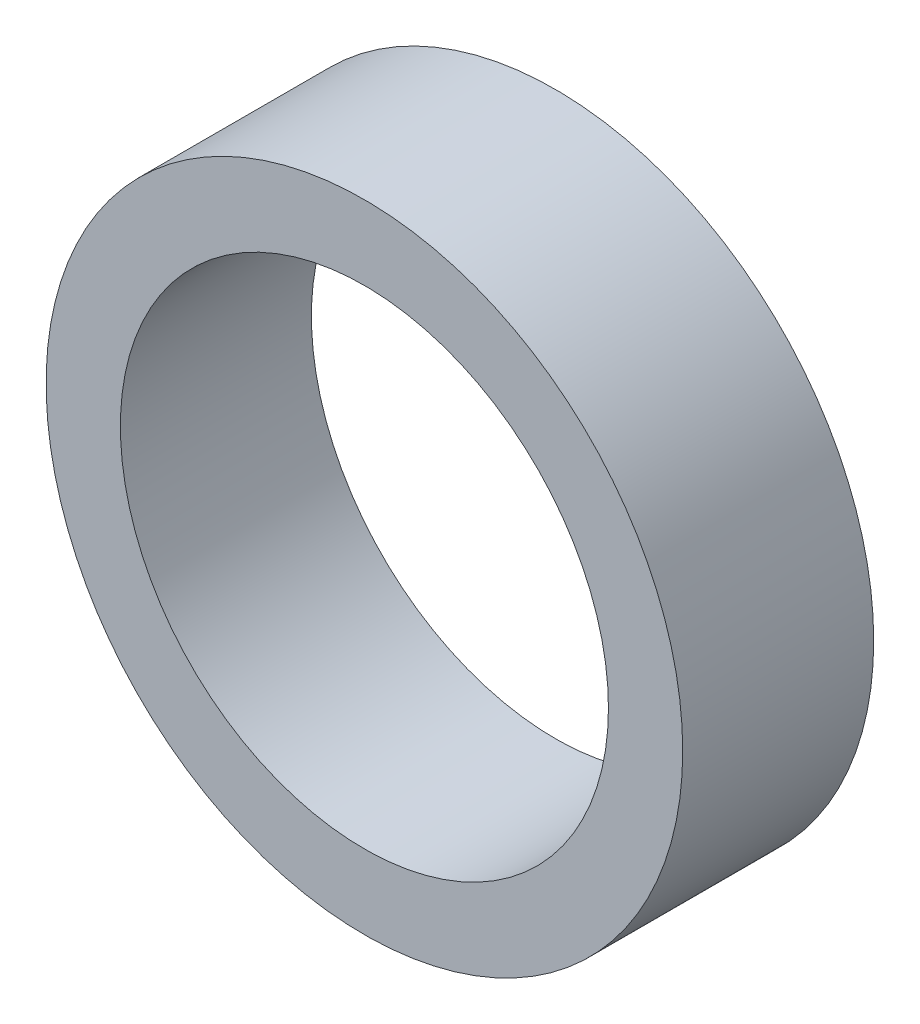
ISO-10303-21;
HEADER;
FILE_DESCRIPTION(('STEP AP214'),'2;1');
FILE_NAME('part.step','',(''),(''),'','','');
FILE_SCHEMA(('AUTOMOTIVE_DESIGN { 1 0 10303 214 1 1 1 1 }'));
ENDSEC;
DATA;
#1=APPLICATION_CONTEXT('core data for automotive mechanical design processes');
#2=APPLICATION_PROTOCOL_DEFINITION('international standard','automotive_design',2000,#1);
#3=PRODUCT_CONTEXT('',#1,'mechanical');
#4=PRODUCT('Part','Part','',(#3));
#5=PRODUCT_RELATED_PRODUCT_CATEGORY('part','',(#4));
#6=PRODUCT_DEFINITION_FORMATION('','',#4);
#7=PRODUCT_DEFINITION_CONTEXT('part definition',#1,'design');
#8=PRODUCT_DEFINITION('design','',#6,#7);
#9=PRODUCT_DEFINITION_SHAPE('','',#8);
#10=(LENGTH_UNIT() NAMED_UNIT(*) SI_UNIT(.MILLI.,.METRE.));
#11=(NAMED_UNIT(*) PLANE_ANGLE_UNIT() SI_UNIT($,.RADIAN.));
#12=(NAMED_UNIT(*) SI_UNIT($,.STERADIAN.) SOLID_ANGLE_UNIT());
#13=UNCERTAINTY_MEASURE_WITH_UNIT(LENGTH_MEASURE(1.E-05),#10,'distance_accuracy_value','');
#14=(GEOMETRIC_REPRESENTATION_CONTEXT(3) GLOBAL_UNCERTAINTY_ASSIGNED_CONTEXT((#13)) GLOBAL_UNIT_ASSIGNED_CONTEXT((#10,
#11,#12)) REPRESENTATION_CONTEXT('',''));
#15=CARTESIAN_POINT('',(0.,0.,0.));
#16=DIRECTION('',(0.,0.,1.));
#17=DIRECTION('',(1.,0.,0.));
#18=AXIS2_PLACEMENT_3D('',#15,#16,#17);
#19=CARTESIAN_POINT('',(0.,0.,18.));
#20=DIRECTION('',(0.,0.,1.));
#21=DIRECTION('',(1.,0.,0.));
#22=AXIS2_PLACEMENT_3D('',#19,#20,#21);
#23=PLANE('',#22);
#24=CARTESIAN_POINT('',(0.,0.,18.));
#25=DIRECTION('',(0.,0.,1.));
#26=DIRECTION('',(1.,0.,0.));
#27=AXIS2_PLACEMENT_3D('',#24,#25,#26);
#28=CIRCLE('',#27,30.);
#29=CARTESIAN_POINT('',(30.,0.,18.));
#30=VERTEX_POINT('',#29);
#31=EDGE_CURVE('E10',#30,#30,#28,.T.);
#32=ORIENTED_EDGE('',*,*,#31,.T.);
#33=EDGE_LOOP('',(#32));
#34=FACE_BOUND('',#33,.T.);
#35=CARTESIAN_POINT('',(0.,0.,18.));
#36=DIRECTION('',(0.,0.,1.));
#37=DIRECTION('',(1.,0.,0.));
#38=AXIS2_PLACEMENT_3D('',#35,#36,#37);
#39=CIRCLE('',#38,23.);
#40=CARTESIAN_POINT('',(23.,0.,18.));
#41=VERTEX_POINT('',#40);
#42=EDGE_CURVE('E48',#41,#41,#39,.T.);
#43=ORIENTED_EDGE('',*,*,#42,.F.);
#44=EDGE_LOOP('',(#43));
#45=FACE_BOUND('',#44,.T.);
#46=ADVANCED_FACE('F37',(#34,#45),#23,.T.);
#47=CARTESIAN_POINT('',(0.,0.,0.));
#48=DIRECTION('',(0.,0.,1.));
#49=DIRECTION('',(1.,0.,0.));
#50=AXIS2_PLACEMENT_3D('',#47,#48,#49);
#51=PLANE('',#50);
#52=CARTESIAN_POINT('',(0.,0.,0.));
#53=DIRECTION('',(0.,0.,1.));
#54=DIRECTION('',(1.,0.,0.));
#55=AXIS2_PLACEMENT_3D('',#52,#53,#54);
#56=CIRCLE('',#55,30.);
#57=CARTESIAN_POINT('',(30.,0.,0.));
#58=VERTEX_POINT('',#57);
#59=EDGE_CURVE('E41',#58,#58,#56,.T.);
#60=ORIENTED_EDGE('',*,*,#59,.F.);
#61=EDGE_LOOP('',(#60));
#62=FACE_BOUND('',#61,.T.);
#63=CARTESIAN_POINT('',(0.,0.,0.));
#64=DIRECTION('',(0.,0.,1.));
#65=DIRECTION('',(1.,0.,0.));
#66=AXIS2_PLACEMENT_3D('',#63,#64,#65);
#67=CIRCLE('',#66,23.);
#68=CARTESIAN_POINT('',(23.,0.,0.));
#69=VERTEX_POINT('',#68);
#70=EDGE_CURVE('E50',#69,#69,#67,.T.);
#71=ORIENTED_EDGE('',*,*,#70,.T.);
#72=EDGE_LOOP('',(#71));
#73=FACE_BOUND('',#72,.T.);
#74=ADVANCED_FACE('F60',(#62,#73),#51,.F.);
#75=CARTESIAN_POINT('',(0.,0.,18.));
#76=DIRECTION('',(0.,0.,-1.));
#77=DIRECTION('',(-1.,0.,0.));
#78=AXIS2_PLACEMENT_3D('',#75,#76,#77);
#79=CYLINDRICAL_SURFACE('',#78,30.);
#80=ORIENTED_EDGE('',*,*,#31,.F.);
#81=EDGE_LOOP('',(#80));
#82=FACE_BOUND('',#81,.T.);
#83=ORIENTED_EDGE('',*,*,#59,.T.);
#84=EDGE_LOOP('',(#83));
#85=FACE_BOUND('',#84,.T.);
#86=ADVANCED_FACE('F39',(#82,#85),#79,.T.);
#87=CARTESIAN_POINT('',(0.,0.,18.));
#88=DIRECTION('',(0.,0.,-1.));
#89=DIRECTION('',(-1.,0.,0.));
#90=AXIS2_PLACEMENT_3D('',#87,#88,#89);
#91=CYLINDRICAL_SURFACE('',#90,23.);
#92=ORIENTED_EDGE('',*,*,#42,.T.);
#93=EDGE_LOOP('',(#92));
#94=FACE_BOUND('',#93,.T.);
#95=ORIENTED_EDGE('',*,*,#70,.F.);
#96=EDGE_LOOP('',(#95));
#97=FACE_BOUND('',#96,.T.);
#98=ADVANCED_FACE('F56',(#94,#97),#91,.F.);
#99=CLOSED_SHELL('',(#46,#74,#86,#98));
#100=MANIFOLD_SOLID_BREP('B2',#99);
#101=ADVANCED_BREP_SHAPE_REPRESENTATION('',(#18,#100),#14);
#102=SHAPE_DEFINITION_REPRESENTATION(#9,#101);
ENDSEC;
END-ISO-10303-21;
